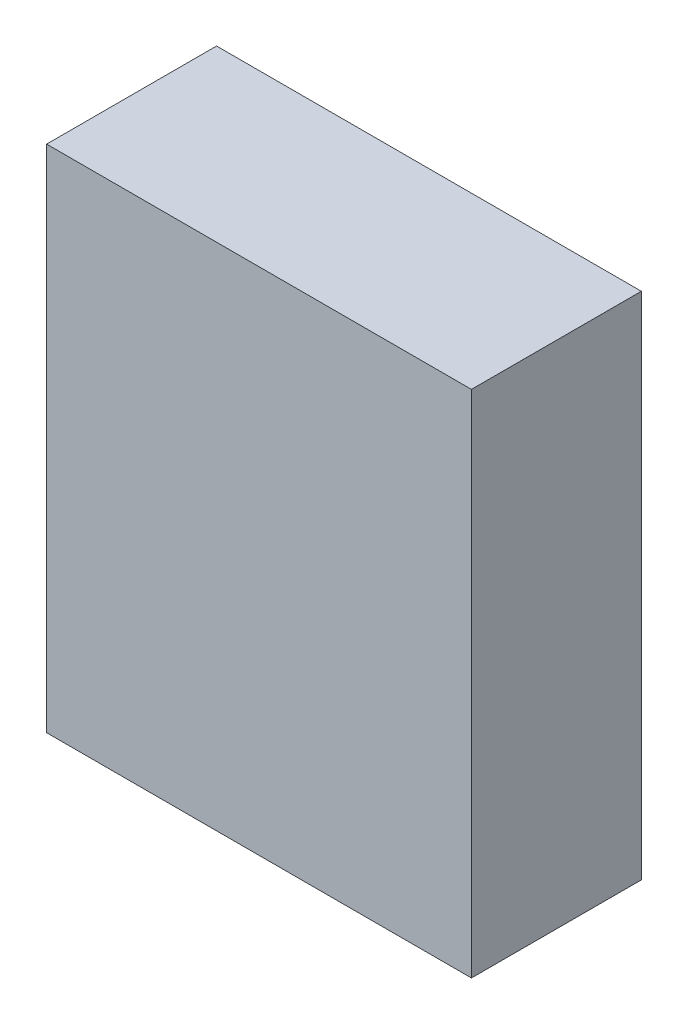
ISO-10303-21;
HEADER;
FILE_DESCRIPTION(('STEP AP214'),'2;1');
FILE_NAME('part.step','',(''),(''),'','','');
FILE_SCHEMA(('AUTOMOTIVE_DESIGN { 1 0 10303 214 1 1 1 1 }'));
ENDSEC;
DATA;
#1=APPLICATION_CONTEXT('core data for automotive mechanical design processes');
#2=APPLICATION_PROTOCOL_DEFINITION('international standard','automotive_design',2000,#1);
#3=PRODUCT_CONTEXT('',#1,'mechanical');
#4=PRODUCT('Part','Part','',(#3));
#5=PRODUCT_RELATED_PRODUCT_CATEGORY('part','',(#4));
#6=PRODUCT_DEFINITION_FORMATION('','',#4);
#7=PRODUCT_DEFINITION_CONTEXT('part definition',#1,'design');
#8=PRODUCT_DEFINITION('design','',#6,#7);
#9=PRODUCT_DEFINITION_SHAPE('','',#8);
#10=(LENGTH_UNIT() NAMED_UNIT(*) SI_UNIT(.MILLI.,.METRE.));
#11=(NAMED_UNIT(*) PLANE_ANGLE_UNIT() SI_UNIT($,.RADIAN.));
#12=(NAMED_UNIT(*) SI_UNIT($,.STERADIAN.) SOLID_ANGLE_UNIT());
#13=UNCERTAINTY_MEASURE_WITH_UNIT(LENGTH_MEASURE(1.E-05),#10,'distance_accuracy_value','');
#14=(GEOMETRIC_REPRESENTATION_CONTEXT(3) GLOBAL_UNCERTAINTY_ASSIGNED_CONTEXT((#13)) GLOBAL_UNIT_ASSIGNED_CONTEXT((#10,
#11,#12)) REPRESENTATION_CONTEXT('',''));
#15=CARTESIAN_POINT('',(0.,0.,0.));
#16=DIRECTION('',(0.,0.,1.));
#17=DIRECTION('',(1.,0.,0.));
#18=AXIS2_PLACEMENT_3D('',#15,#16,#17);
#19=CARTESIAN_POINT('',(0.,0.,0.));
#20=DIRECTION('',(0.,0.,-1.));
#21=DIRECTION('',(-1.,0.,0.));
#22=AXIS2_PLACEMENT_3D('',#19,#20,#21);
#23=PLANE('',#22);
#24=DIRECTION('',(0.,1.,0.));
#25=VECTOR('',#24,1.);
#26=CARTESIAN_POINT('',(7.50000000000002,0.,0.));
#27=LINE('',#26,#25);
#28=CARTESIAN_POINT('',(7.50000000000002,92.5,0.));
#29=VERTEX_POINT('',#28);
#30=CARTESIAN_POINT('',(7.50000000000002,107.5,0.));
#31=VERTEX_POINT('',#30);
#32=EDGE_CURVE('E114',#29,#31,#27,.T.);
#33=ORIENTED_EDGE('',*,*,#32,.T.);
#34=DIRECTION('',(1.,0.,0.));
#35=VECTOR('',#34,1.);
#36=CARTESIAN_POINT('',(0.,107.5,0.));
#37=LINE('',#36,#35);
#38=CARTESIAN_POINT('',(-7.49999999999998,107.5,0.));
#39=VERTEX_POINT('',#38);
#40=EDGE_CURVE('E173',#39,#31,#37,.T.);
#41=ORIENTED_EDGE('',*,*,#40,.F.);
#42=DIRECTION('',(0.,1.,0.));
#43=VECTOR('',#42,1.);
#44=CARTESIAN_POINT('',(-7.49999999999998,0.,0.));
#45=LINE('',#44,#43);
#46=CARTESIAN_POINT('',(-7.49999999999998,92.5,0.));
#47=VERTEX_POINT('',#46);
#48=EDGE_CURVE('E132',#47,#39,#45,.T.);
#49=ORIENTED_EDGE('',*,*,#48,.F.);
#50=DIRECTION('',(1.,0.,0.));
#51=VECTOR('',#50,1.);
#52=CARTESIAN_POINT('',(0.,92.5,0.));
#53=LINE('',#52,#51);
#54=EDGE_CURVE('E125',#47,#29,#53,.T.);
#55=ORIENTED_EDGE('',*,*,#54,.T.);
#56=EDGE_LOOP('',(#33,#41,#49,#55));
#57=FACE_BOUND('',#56,.T.);
#58=DIRECTION('',(0.,1.,0.));
#59=VECTOR('',#58,1.);
#60=CARTESIAN_POINT('',(125.,-150.,0.));
#61=LINE('',#60,#59);
#62=CARTESIAN_POINT('',(125.,-150.,0.));
#63=VERTEX_POINT('',#62);
#64=CARTESIAN_POINT('',(125.,150.,0.));
#65=VERTEX_POINT('',#64);
#66=EDGE_CURVE('E178',#63,#65,#61,.T.);
#67=ORIENTED_EDGE('',*,*,#66,.F.);
#68=DIRECTION('',(1.,0.,0.));
#69=VECTOR('',#68,1.);
#70=CARTESIAN_POINT('',(-125.,-150.,0.));
#71=LINE('',#70,#69);
#72=CARTESIAN_POINT('',(-125.,-150.,0.));
#73=VERTEX_POINT('',#72);
#74=EDGE_CURVE('E183',#73,#63,#71,.T.);
#75=ORIENTED_EDGE('',*,*,#74,.F.);
#76=DIRECTION('',(0.,-1.,0.));
#77=VECTOR('',#76,1.);
#78=CARTESIAN_POINT('',(-125.,-150.,0.));
#79=LINE('',#78,#77);
#80=CARTESIAN_POINT('',(-125.,150.,0.));
#81=VERTEX_POINT('',#80);
#82=EDGE_CURVE('E194',#81,#73,#79,.T.);
#83=ORIENTED_EDGE('',*,*,#82,.F.);
#84=DIRECTION('',(-1.,0.,0.));
#85=VECTOR('',#84,1.);
#86=CARTESIAN_POINT('',(-125.,150.,0.));
#87=LINE('',#86,#85);
#88=EDGE_CURVE('E192',#65,#81,#87,.T.);
#89=ORIENTED_EDGE('',*,*,#88,.F.);
#90=EDGE_LOOP('',(#67,#75,#83,#89));
#91=FACE_BOUND('',#90,.T.);
#92=DIRECTION('',(0.,1.,0.));
#93=VECTOR('',#92,1.);
#94=CARTESIAN_POINT('',(7.49999999999999,0.,0.));
#95=LINE('',#94,#93);
#96=CARTESIAN_POINT('',(7.49999999999999,-107.5,0.));
#97=VERTEX_POINT('',#96);
#98=CARTESIAN_POINT('',(7.49999999999999,-92.5,0.));
#99=VERTEX_POINT('',#98);
#100=EDGE_CURVE('E165',#97,#99,#95,.T.);
#101=ORIENTED_EDGE('',*,*,#100,.T.);
#102=DIRECTION('',(1.,0.,0.));
#103=VECTOR('',#102,1.);
#104=CARTESIAN_POINT('',(0.,-92.5,0.));
#105=LINE('',#104,#103);
#106=CARTESIAN_POINT('',(-7.50000000000001,-92.5,0.));
#107=VERTEX_POINT('',#106);
#108=EDGE_CURVE('E162',#107,#99,#105,.T.);
#109=ORIENTED_EDGE('',*,*,#108,.F.);
#110=DIRECTION('',(0.,1.,0.));
#111=VECTOR('',#110,1.);
#112=CARTESIAN_POINT('',(-7.50000000000001,0.,0.));
#113=LINE('',#112,#111);
#114=CARTESIAN_POINT('',(-7.50000000000001,-107.5,0.));
#115=VERTEX_POINT('',#114);
#116=EDGE_CURVE('E171',#115,#107,#113,.T.);
#117=ORIENTED_EDGE('',*,*,#116,.F.);
#118=DIRECTION('',(1.,0.,0.));
#119=VECTOR('',#118,1.);
#120=CARTESIAN_POINT('',(0.,-107.5,0.));
#121=LINE('',#120,#119);
#122=EDGE_CURVE('E169',#115,#97,#121,.T.);
#123=ORIENTED_EDGE('',*,*,#122,.T.);
#124=EDGE_LOOP('',(#101,#109,#117,#123));
#125=FACE_BOUND('',#124,.T.);
#126=ADVANCED_FACE('F38',(#57,#91,#125),#23,.T.);
#127=CARTESIAN_POINT('',(125.,-150.,100.));
#128=DIRECTION('',(-1.,0.,0.));
#129=DIRECTION('',(0.,0.,1.));
#130=AXIS2_PLACEMENT_3D('',#127,#128,#129);
#131=PLANE('',#130);
#132=ORIENTED_EDGE('',*,*,#66,.T.);
#133=DIRECTION('',(0.,0.,-1.));
#134=VECTOR('',#133,1.);
#135=CARTESIAN_POINT('',(125.,150.,100.));
#136=LINE('',#135,#134);
#137=CARTESIAN_POINT('',(125.,150.,100.));
#138=VERTEX_POINT('',#137);
#139=EDGE_CURVE('E138',#138,#65,#136,.T.);
#140=ORIENTED_EDGE('',*,*,#139,.F.);
#141=DIRECTION('',(0.,1.,0.));
#142=VECTOR('',#141,1.);
#143=CARTESIAN_POINT('',(125.,-150.,100.));
#144=LINE('',#143,#142);
#145=CARTESIAN_POINT('',(125.,-150.,100.));
#146=VERTEX_POINT('',#145);
#147=EDGE_CURVE('E179',#146,#138,#144,.T.);
#148=ORIENTED_EDGE('',*,*,#147,.F.);
#149=DIRECTION('',(0.,0.,-1.));
#150=VECTOR('',#149,1.);
#151=CARTESIAN_POINT('',(125.,-150.,100.));
#152=LINE('',#151,#150);
#153=EDGE_CURVE('E189',#146,#63,#152,.T.);
#154=ORIENTED_EDGE('',*,*,#153,.T.);
#155=EDGE_LOOP('',(#132,#140,#148,#154));
#156=FACE_BOUND('',#155,.T.);
#157=ADVANCED_FACE('F217',(#156),#131,.F.);
#158=CARTESIAN_POINT('',(-125.,150.,100.));
#159=DIRECTION('',(0.,-1.,0.));
#160=DIRECTION('',(0.,0.,-1.));
#161=AXIS2_PLACEMENT_3D('',#158,#159,#160);
#162=PLANE('',#161);
#163=ORIENTED_EDGE('',*,*,#88,.T.);
#164=DIRECTION('',(0.,0.,-1.));
#165=VECTOR('',#164,1.);
#166=CARTESIAN_POINT('',(-125.,150.,100.));
#167=LINE('',#166,#165);
#168=CARTESIAN_POINT('',(-125.,150.,100.));
#169=VERTEX_POINT('',#168);
#170=EDGE_CURVE('E143',#169,#81,#167,.T.);
#171=ORIENTED_EDGE('',*,*,#170,.F.);
#172=DIRECTION('',(-1.,0.,0.));
#173=VECTOR('',#172,1.);
#174=CARTESIAN_POINT('',(-125.,150.,100.));
#175=LINE('',#174,#173);
#176=EDGE_CURVE('E182',#138,#169,#175,.T.);
#177=ORIENTED_EDGE('',*,*,#176,.F.);
#178=ORIENTED_EDGE('',*,*,#139,.T.);
#179=EDGE_LOOP('',(#163,#171,#177,#178));
#180=FACE_BOUND('',#179,.T.);
#181=ADVANCED_FACE('F221',(#180),#162,.F.);
#182=CARTESIAN_POINT('',(-125.,-150.,100.));
#183=DIRECTION('',(1.,0.,0.));
#184=DIRECTION('',(0.,0.,-1.));
#185=AXIS2_PLACEMENT_3D('',#182,#183,#184);
#186=PLANE('',#185);
#187=ORIENTED_EDGE('',*,*,#82,.T.);
#188=DIRECTION('',(0.,0.,-1.));
#189=VECTOR('',#188,1.);
#190=CARTESIAN_POINT('',(-125.,-150.,100.));
#191=LINE('',#190,#189);
#192=CARTESIAN_POINT('',(-125.,-150.,100.));
#193=VERTEX_POINT('',#192);
#194=EDGE_CURVE('E199',#193,#73,#191,.T.);
#195=ORIENTED_EDGE('',*,*,#194,.F.);
#196=DIRECTION('',(0.,-1.,0.));
#197=VECTOR('',#196,1.);
#198=CARTESIAN_POINT('',(-125.,-150.,100.));
#199=LINE('',#198,#197);
#200=EDGE_CURVE('E185',#169,#193,#199,.T.);
#201=ORIENTED_EDGE('',*,*,#200,.F.);
#202=ORIENTED_EDGE('',*,*,#170,.T.);
#203=EDGE_LOOP('',(#187,#195,#201,#202));
#204=FACE_BOUND('',#203,.T.);
#205=ADVANCED_FACE('F206',(#204),#186,.F.);
#206=CARTESIAN_POINT('',(-125.,-150.,100.));
#207=DIRECTION('',(0.,1.,0.));
#208=DIRECTION('',(0.,0.,1.));
#209=AXIS2_PLACEMENT_3D('',#206,#207,#208);
#210=PLANE('',#209);
#211=ORIENTED_EDGE('',*,*,#74,.T.);
#212=ORIENTED_EDGE('',*,*,#153,.F.);
#213=DIRECTION('',(1.,0.,0.));
#214=VECTOR('',#213,1.);
#215=CARTESIAN_POINT('',(-125.,-150.,100.));
#216=LINE('',#215,#214);
#217=EDGE_CURVE('E187',#193,#146,#216,.T.);
#218=ORIENTED_EDGE('',*,*,#217,.F.);
#219=ORIENTED_EDGE('',*,*,#194,.T.);
#220=EDGE_LOOP('',(#211,#212,#218,#219));
#221=FACE_BOUND('',#220,.T.);
#222=ADVANCED_FACE('F213',(#221),#210,.F.);
#223=CARTESIAN_POINT('',(0.,0.,100.));
#224=DIRECTION('',(0.,0.,-1.));
#225=DIRECTION('',(-1.,0.,0.));
#226=AXIS2_PLACEMENT_3D('',#223,#224,#225);
#227=PLANE('',#226);
#228=ORIENTED_EDGE('',*,*,#147,.T.);
#229=ORIENTED_EDGE('',*,*,#176,.T.);
#230=ORIENTED_EDGE('',*,*,#200,.T.);
#231=ORIENTED_EDGE('',*,*,#217,.T.);
#232=EDGE_LOOP('',(#228,#229,#230,#231));
#233=FACE_BOUND('',#232,.T.);
#234=ADVANCED_FACE('F220',(#233),#227,.F.);
#235=CARTESIAN_POINT('',(7.49999999999999,0.,-7.5));
#236=DIRECTION('',(1.,0.,0.));
#237=DIRECTION('',(0.,0.,-1.));
#238=AXIS2_PLACEMENT_3D('',#235,#236,#237);
#239=PLANE('',#238);
#240=ORIENTED_EDGE('',*,*,#100,.F.);
#241=CARTESIAN_POINT('',(7.49999999999999,-100.,0.));
#242=DIRECTION('',(1.,0.,0.));
#243=DIRECTION('',(0.,0.,-1.));
#244=AXIS2_PLACEMENT_3D('',#241,#242,#243);
#245=CIRCLE('',#244,7.5);
#246=CARTESIAN_POINT('',(7.49999999999999,-100.,-7.5));
#247=VERTEX_POINT('',#246);
#248=EDGE_CURVE('E61',#97,#247,#245,.T.);
#249=ORIENTED_EDGE('',*,*,#248,.T.);
#250=CARTESIAN_POINT('',(7.49999999999999,-100.,0.));
#251=DIRECTION('',(1.,0.,0.));
#252=DIRECTION('',(0.,0.,-1.));
#253=AXIS2_PLACEMENT_3D('',#250,#251,#252);
#254=CIRCLE('',#253,7.5);
#255=EDGE_CURVE('E150',#247,#99,#254,.T.);
#256=ORIENTED_EDGE('',*,*,#255,.T.);
#257=EDGE_LOOP('',(#240,#249,#256));
#258=FACE_BOUND('',#257,.T.);
#259=ADVANCED_FACE('F164',(#258),#239,.T.);
#260=CARTESIAN_POINT('',(-7.50000000000001,0.,-7.5));
#261=DIRECTION('',(1.,0.,0.));
#262=DIRECTION('',(0.,0.,-1.));
#263=AXIS2_PLACEMENT_3D('',#260,#261,#262);
#264=PLANE('',#263);
#265=CARTESIAN_POINT('',(-7.50000000000001,-100.,0.));
#266=DIRECTION('',(1.,0.,0.));
#267=DIRECTION('',(0.,0.,-1.));
#268=AXIS2_PLACEMENT_3D('',#265,#266,#267);
#269=CIRCLE('',#268,7.5);
#270=CARTESIAN_POINT('',(-7.50000000000001,-100.,-7.5));
#271=VERTEX_POINT('',#270);
#272=EDGE_CURVE('E47',#107,#271,#269,.F.);
#273=ORIENTED_EDGE('',*,*,#272,.T.);
#274=CARTESIAN_POINT('',(-7.50000000000001,-100.,0.));
#275=DIRECTION('',(1.,0.,0.));
#276=DIRECTION('',(0.,0.,-1.));
#277=AXIS2_PLACEMENT_3D('',#274,#275,#276);
#278=CIRCLE('',#277,7.5);
#279=EDGE_CURVE('E11',#271,#115,#278,.F.);
#280=ORIENTED_EDGE('',*,*,#279,.T.);
#281=ORIENTED_EDGE('',*,*,#116,.T.);
#282=EDGE_LOOP('',(#273,#280,#281));
#283=FACE_BOUND('',#282,.T.);
#284=ADVANCED_FACE('F244',(#283),#264,.F.);
#285=CARTESIAN_POINT('',(7.50000000000002,0.,-7.5));
#286=DIRECTION('',(1.,0.,0.));
#287=DIRECTION('',(0.,0.,-1.));
#288=AXIS2_PLACEMENT_3D('',#285,#286,#287);
#289=PLANE('',#288);
#290=CARTESIAN_POINT('',(7.50000000000002,100.,0.));
#291=DIRECTION('',(1.,0.,0.));
#292=DIRECTION('',(0.,0.,-1.));
#293=AXIS2_PLACEMENT_3D('',#290,#291,#292);
#294=CIRCLE('',#293,7.5);
#295=CARTESIAN_POINT('',(7.50000000000002,100.,-7.5));
#296=VERTEX_POINT('',#295);
#297=EDGE_CURVE('E118',#29,#296,#294,.T.);
#298=ORIENTED_EDGE('',*,*,#297,.T.);
#299=CARTESIAN_POINT('',(7.50000000000002,100.,0.));
#300=DIRECTION('',(1.,0.,0.));
#301=DIRECTION('',(0.,0.,-1.));
#302=AXIS2_PLACEMENT_3D('',#299,#300,#301);
#303=CIRCLE('',#302,7.5);
#304=EDGE_CURVE('E121',#296,#31,#303,.T.);
#305=ORIENTED_EDGE('',*,*,#304,.T.);
#306=ORIENTED_EDGE('',*,*,#32,.F.);
#307=EDGE_LOOP('',(#298,#305,#306));
#308=FACE_BOUND('',#307,.T.);
#309=ADVANCED_FACE('F116',(#308),#289,.T.);
#310=CARTESIAN_POINT('',(-7.49999999999998,0.,-7.5));
#311=DIRECTION('',(1.,0.,0.));
#312=DIRECTION('',(0.,1.,0.));
#313=AXIS2_PLACEMENT_3D('',#310,#311,#312);
#314=PLANE('',#313);
#315=ORIENTED_EDGE('',*,*,#48,.T.);
#316=CARTESIAN_POINT('',(-7.49999999999998,100.,0.));
#317=DIRECTION('',(1.,0.,0.));
#318=DIRECTION('',(0.,1.,0.));
#319=AXIS2_PLACEMENT_3D('',#316,#317,#318);
#320=CIRCLE('',#319,7.5);
#321=CARTESIAN_POINT('',(-7.49999999999998,100.,-7.5));
#322=VERTEX_POINT('',#321);
#323=EDGE_CURVE('E148',#39,#322,#320,.F.);
#324=ORIENTED_EDGE('',*,*,#323,.T.);
#325=CARTESIAN_POINT('',(-7.49999999999998,100.,0.));
#326=DIRECTION('',(1.,0.,0.));
#327=DIRECTION('',(0.,1.,0.));
#328=AXIS2_PLACEMENT_3D('',#325,#326,#327);
#329=CIRCLE('',#328,7.5);
#330=EDGE_CURVE('E140',#322,#47,#329,.F.);
#331=ORIENTED_EDGE('',*,*,#330,.T.);
#332=EDGE_LOOP('',(#315,#324,#331));
#333=FACE_BOUND('',#332,.T.);
#334=ADVANCED_FACE('F252',(#333),#314,.F.);
#335=CARTESIAN_POINT('',(0.,100.,0.));
#336=DIRECTION('',(1.,0.,0.));
#337=DIRECTION('',(0.,0.,-1.));
#338=AXIS2_PLACEMENT_3D('',#335,#336,#337);
#339=CYLINDRICAL_SURFACE('',#338,7.5);
#340=ORIENTED_EDGE('',*,*,#54,.F.);
#341=ORIENTED_EDGE('',*,*,#330,.F.);
#342=DIRECTION('',(1.,0.,0.));
#343=VECTOR('',#342,1.);
#344=CARTESIAN_POINT('',(0.,100.,-7.5));
#345=LINE('',#344,#343);
#346=EDGE_CURVE('E126',#296,#322,#345,.F.);
#347=ORIENTED_EDGE('',*,*,#346,.F.);
#348=ORIENTED_EDGE('',*,*,#297,.F.);
#349=EDGE_LOOP('',(#340,#341,#347,#348));
#350=FACE_BOUND('',#349,.T.);
#351=ADVANCED_FACE('F136',(#350),#339,.T.);
#352=CARTESIAN_POINT('',(0.,100.,0.));
#353=DIRECTION('',(-1.,0.,0.));
#354=DIRECTION('',(0.,0.,1.));
#355=AXIS2_PLACEMENT_3D('',#352,#353,#354);
#356=CYLINDRICAL_SURFACE('',#355,7.5);
#357=ORIENTED_EDGE('',*,*,#323,.F.);
#358=ORIENTED_EDGE('',*,*,#40,.T.);
#359=ORIENTED_EDGE('',*,*,#304,.F.);
#360=ORIENTED_EDGE('',*,*,#346,.T.);
#361=EDGE_LOOP('',(#357,#358,#359,#360));
#362=FACE_BOUND('',#361,.T.);
#363=ADVANCED_FACE('F258',(#362),#356,.T.);
#364=CARTESIAN_POINT('',(0.,-100.,0.));
#365=DIRECTION('',(-1.,0.,0.));
#366=DIRECTION('',(0.,0.,1.));
#367=AXIS2_PLACEMENT_3D('',#364,#365,#366);
#368=CYLINDRICAL_SURFACE('',#367,7.5);
#369=DIRECTION('',(1.,0.,0.));
#370=VECTOR('',#369,1.);
#371=CARTESIAN_POINT('',(7.49999999999999,-100.,-7.5));
#372=LINE('',#371,#370);
#373=EDGE_CURVE('E42',#271,#247,#372,.T.);
#374=ORIENTED_EDGE('',*,*,#373,.F.);
#375=ORIENTED_EDGE('',*,*,#272,.F.);
#376=ORIENTED_EDGE('',*,*,#108,.T.);
#377=ORIENTED_EDGE('',*,*,#255,.F.);
#378=EDGE_LOOP('',(#374,#375,#376,#377));
#379=FACE_BOUND('',#378,.T.);
#380=ADVANCED_FACE('F40',(#379),#368,.T.);
#381=CARTESIAN_POINT('',(0.,-100.,0.));
#382=DIRECTION('',(1.,0.,0.));
#383=DIRECTION('',(0.,0.,-1.));
#384=AXIS2_PLACEMENT_3D('',#381,#382,#383);
#385=CYLINDRICAL_SURFACE('',#384,7.5);
#386=ORIENTED_EDGE('',*,*,#279,.F.);
#387=ORIENTED_EDGE('',*,*,#373,.T.);
#388=ORIENTED_EDGE('',*,*,#248,.F.);
#389=ORIENTED_EDGE('',*,*,#122,.F.);
#390=EDGE_LOOP('',(#386,#387,#388,#389));
#391=FACE_BOUND('',#390,.T.);
#392=ADVANCED_FACE('F157',(#391),#385,.T.);
#393=CLOSED_SHELL('',(#126,#157,#181,#205,#222,#234,#259,#284,#309,#334,#351,#363,#380,#392));
#394=MANIFOLD_SOLID_BREP('B2',#393);
#395=ADVANCED_BREP_SHAPE_REPRESENTATION('',(#18,#394),#14);
#396=SHAPE_DEFINITION_REPRESENTATION(#9,#395);
ENDSEC;
END-ISO-10303-21;
